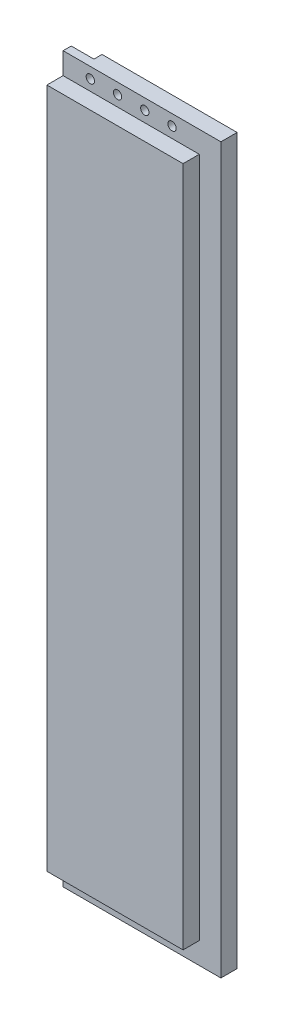
ISO-10303-21;
HEADER;
FILE_DESCRIPTION(('STEP AP214'),'2;1');
FILE_NAME('part.step','',(''),(''),'','','');
FILE_SCHEMA(('AUTOMOTIVE_DESIGN { 1 0 10303 214 1 1 1 1 }'));
ENDSEC;
DATA;
#1=APPLICATION_CONTEXT('core data for automotive mechanical design processes');
#2=APPLICATION_PROTOCOL_DEFINITION('international standard','automotive_design',2000,#1);
#3=PRODUCT_CONTEXT('',#1,'mechanical');
#4=PRODUCT('Part','Part','',(#3));
#5=PRODUCT_RELATED_PRODUCT_CATEGORY('part','',(#4));
#6=PRODUCT_DEFINITION_FORMATION('','',#4);
#7=PRODUCT_DEFINITION_CONTEXT('part definition',#1,'design');
#8=PRODUCT_DEFINITION('design','',#6,#7);
#9=PRODUCT_DEFINITION_SHAPE('','',#8);
#10=(LENGTH_UNIT() NAMED_UNIT(*) SI_UNIT(.MILLI.,.METRE.));
#11=(NAMED_UNIT(*) PLANE_ANGLE_UNIT() SI_UNIT($,.RADIAN.));
#12=(NAMED_UNIT(*) SI_UNIT($,.STERADIAN.) SOLID_ANGLE_UNIT());
#13=UNCERTAINTY_MEASURE_WITH_UNIT(LENGTH_MEASURE(1.E-05),#10,'distance_accuracy_value','');
#14=(GEOMETRIC_REPRESENTATION_CONTEXT(3) GLOBAL_UNCERTAINTY_ASSIGNED_CONTEXT((#13)) GLOBAL_UNIT_ASSIGNED_CONTEXT((#10,
#11,#12)) REPRESENTATION_CONTEXT('',''));
#15=CARTESIAN_POINT('',(0.,0.,0.));
#16=DIRECTION('',(0.,0.,1.));
#17=DIRECTION('',(1.,0.,0.));
#18=AXIS2_PLACEMENT_3D('',#15,#16,#17);
#19=CARTESIAN_POINT('',(-67.9096471096971,425.45,-3.31673558824982));
#20=DIRECTION('',(1.,0.,0.));
#21=DIRECTION('',(0.,0.,-1.));
#22=AXIS2_PLACEMENT_3D('',#19,#20,#21);
#23=PLANE('',#22);
#24=DIRECTION('',(0.,1.,0.));
#25=VECTOR('',#24,1.);
#26=CARTESIAN_POINT('',(-67.9096471096971,0.,1.43306441175018));
#27=LINE('',#26,#25);
#28=CARTESIAN_POINT('',(-67.9096471096971,0.,1.43306441175018));
#29=VERTEX_POINT('',#28);
#30=CARTESIAN_POINT('',(-67.9096471096971,425.45,1.43306441175018));
#31=VERTEX_POINT('',#30);
#32=EDGE_CURVE('E242',#29,#31,#27,.T.);
#33=ORIENTED_EDGE('',*,*,#32,.F.);
#34=DIRECTION('',(0.,0.,1.));
#35=VECTOR('',#34,1.);
#36=CARTESIAN_POINT('',(-67.9096471096971,0.,-3.31673558824982));
#37=LINE('',#36,#35);
#38=CARTESIAN_POINT('',(-67.9096471096971,0.,6.20826441175017));
#39=VERTEX_POINT('',#38);
#40=EDGE_CURVE('E138',#29,#39,#37,.T.);
#41=ORIENTED_EDGE('',*,*,#40,.T.);
#42=DIRECTION('',(0.,1.,0.));
#43=VECTOR('',#42,1.);
#44=CARTESIAN_POINT('',(-67.9096471096971,12.7,6.20826441175018));
#45=LINE('',#44,#43);
#46=CARTESIAN_POINT('',(-67.9096471096971,12.7,6.20826441175018));
#47=VERTEX_POINT('',#46);
#48=EDGE_CURVE('E185',#39,#47,#45,.T.);
#49=ORIENTED_EDGE('',*,*,#48,.T.);
#50=DIRECTION('',(0.,0.,1.));
#51=VECTOR('',#50,1.);
#52=CARTESIAN_POINT('',(-67.9096471096971,12.7,15.7332644117502));
#53=LINE('',#52,#51);
#54=CARTESIAN_POINT('',(-67.9096471096971,12.7,15.7332644117502));
#55=VERTEX_POINT('',#54);
#56=EDGE_CURVE('E177',#47,#55,#53,.T.);
#57=ORIENTED_EDGE('',*,*,#56,.T.);
#58=DIRECTION('',(0.,-1.,0.));
#59=VECTOR('',#58,1.);
#60=CARTESIAN_POINT('',(-67.9096471096971,425.45,15.7332644117502));
#61=LINE('',#60,#59);
#62=CARTESIAN_POINT('',(-67.9096471096971,412.75,15.7332644117502));
#63=VERTEX_POINT('',#62);
#64=EDGE_CURVE('E11',#63,#55,#61,.T.);
#65=ORIENTED_EDGE('',*,*,#64,.F.);
#66=DIRECTION('',(0.,0.,-1.));
#67=VECTOR('',#66,1.);
#68=CARTESIAN_POINT('',(-67.9096471096971,412.75,15.7332644117502));
#69=LINE('',#68,#67);
#70=CARTESIAN_POINT('',(-67.9096471096971,412.75,6.20826441175018));
#71=VERTEX_POINT('',#70);
#72=EDGE_CURVE('E167',#63,#71,#69,.T.);
#73=ORIENTED_EDGE('',*,*,#72,.T.);
#74=DIRECTION('',(0.,1.,0.));
#75=VECTOR('',#74,1.);
#76=CARTESIAN_POINT('',(-67.9096471096971,425.45,6.20826441175018));
#77=LINE('',#76,#75);
#78=CARTESIAN_POINT('',(-67.9096471096971,425.45,6.20826441175018));
#79=VERTEX_POINT('',#78);
#80=EDGE_CURVE('E162',#71,#79,#77,.T.);
#81=ORIENTED_EDGE('',*,*,#80,.T.);
#82=DIRECTION('',(0.,0.,1.));
#83=VECTOR('',#82,1.);
#84=CARTESIAN_POINT('',(-67.9096471096971,425.45,-3.31673558824982));
#85=LINE('',#84,#83);
#86=EDGE_CURVE('E133',#31,#79,#85,.T.);
#87=ORIENTED_EDGE('',*,*,#86,.F.);
#88=EDGE_LOOP('',(#33,#41,#49,#57,#65,#73,#81,#87));
#89=FACE_BOUND('',#88,.T.);
#90=ADVANCED_FACE('F33',(#89),#23,.F.);
#91=CARTESIAN_POINT('',(-67.9096471096971,425.45,-3.31673558824982));
#92=DIRECTION('',(0.,0.,1.));
#93=DIRECTION('',(1.,0.,0.));
#94=AXIS2_PLACEMENT_3D('',#91,#92,#93);
#95=PLANE('',#94);
#96=CARTESIAN_POINT('',(-3.91164710969707,419.1,-3.31673558824982));
#97=DIRECTION('',(0.,0.,1.));
#98=DIRECTION('',(1.,0.,0.));
#99=AXIS2_PLACEMENT_3D('',#96,#97,#98);
#100=CIRCLE('',#99,2.45745);
#101=CARTESIAN_POINT('',(-1.45419710969707,419.1,-3.31673558824982));
#102=VERTEX_POINT('',#101);
#103=EDGE_CURVE('E194',#102,#102,#100,.T.);
#104=ORIENTED_EDGE('',*,*,#103,.T.);
#105=EDGE_LOOP('',(#104));
#106=FACE_BOUND('',#105,.T.);
#107=CARTESIAN_POINT('',(-19.9136471096971,419.1,-3.31673558824982));
#108=DIRECTION('',(0.,0.,1.));
#109=DIRECTION('',(1.,0.,0.));
#110=AXIS2_PLACEMENT_3D('',#107,#108,#109);
#111=CIRCLE('',#110,2.45745);
#112=CARTESIAN_POINT('',(-17.4561971096971,419.1,-3.31673558824982));
#113=VERTEX_POINT('',#112);
#114=EDGE_CURVE('E200',#113,#113,#111,.T.);
#115=ORIENTED_EDGE('',*,*,#114,.T.);
#116=EDGE_LOOP('',(#115));
#117=FACE_BOUND('',#116,.T.);
#118=CARTESIAN_POINT('',(-35.9156471096971,419.1,-3.31673558824982));
#119=DIRECTION('',(0.,0.,1.));
#120=DIRECTION('',(1.,0.,0.));
#121=AXIS2_PLACEMENT_3D('',#118,#119,#120);
#122=CIRCLE('',#121,2.45745);
#123=CARTESIAN_POINT('',(-33.4581971096971,419.1,-3.31673558824982));
#124=VERTEX_POINT('',#123);
#125=EDGE_CURVE('E206',#124,#124,#122,.T.);
#126=ORIENTED_EDGE('',*,*,#125,.T.);
#127=EDGE_LOOP('',(#126));
#128=FACE_BOUND('',#127,.T.);
#129=CARTESIAN_POINT('',(-51.9176471096971,419.1,-3.31673558824982));
#130=DIRECTION('',(0.,0.,1.));
#131=DIRECTION('',(1.,0.,0.));
#132=AXIS2_PLACEMENT_3D('',#129,#130,#131);
#133=CIRCLE('',#132,2.45745);
#134=CARTESIAN_POINT('',(-49.4601971096971,419.1,-3.31673558824982));
#135=VERTEX_POINT('',#134);
#136=EDGE_CURVE('E212',#135,#135,#133,.T.);
#137=ORIENTED_EDGE('',*,*,#136,.T.);
#138=EDGE_LOOP('',(#137));
#139=FACE_BOUND('',#138,.T.);
#140=CARTESIAN_POINT('',(-3.91164710969707,6.35000000000002,-3.31673558824982));
#141=DIRECTION('',(0.,0.,1.));
#142=DIRECTION('',(1.,0.,0.));
#143=AXIS2_PLACEMENT_3D('',#140,#141,#142);
#144=CIRCLE('',#143,2.45745);
#145=CARTESIAN_POINT('',(-1.45419710969707,6.35000000000002,-3.31673558824982));
#146=VERTEX_POINT('',#145);
#147=EDGE_CURVE('E218',#146,#146,#144,.T.);
#148=ORIENTED_EDGE('',*,*,#147,.T.);
#149=EDGE_LOOP('',(#148));
#150=FACE_BOUND('',#149,.T.);
#151=CARTESIAN_POINT('',(-19.9136471096971,6.35000000000002,-3.31673558824982));
#152=DIRECTION('',(0.,0.,1.));
#153=DIRECTION('',(1.,0.,0.));
#154=AXIS2_PLACEMENT_3D('',#151,#152,#153);
#155=CIRCLE('',#154,2.45745);
#156=CARTESIAN_POINT('',(-17.4561971096971,6.35000000000002,-3.31673558824982));
#157=VERTEX_POINT('',#156);
#158=EDGE_CURVE('E224',#157,#157,#155,.T.);
#159=ORIENTED_EDGE('',*,*,#158,.T.);
#160=EDGE_LOOP('',(#159));
#161=FACE_BOUND('',#160,.T.);
#162=CARTESIAN_POINT('',(-35.9156471096971,6.35000000000002,-3.31673558824982));
#163=DIRECTION('',(0.,0.,1.));
#164=DIRECTION('',(1.,0.,0.));
#165=AXIS2_PLACEMENT_3D('',#162,#163,#164);
#166=CIRCLE('',#165,2.45745);
#167=CARTESIAN_POINT('',(-33.4581971096971,6.35000000000002,-3.31673558824982));
#168=VERTEX_POINT('',#167);
#169=EDGE_CURVE('E230',#168,#168,#166,.T.);
#170=ORIENTED_EDGE('',*,*,#169,.T.);
#171=EDGE_LOOP('',(#170));
#172=FACE_BOUND('',#171,.T.);
#173=CARTESIAN_POINT('',(-51.9176471096971,6.35,-3.31673558824982));
#174=DIRECTION('',(0.,0.,1.));
#175=DIRECTION('',(1.,0.,0.));
#176=AXIS2_PLACEMENT_3D('',#173,#174,#175);
#177=CIRCLE('',#176,2.45745);
#178=CARTESIAN_POINT('',(-49.4601971096971,6.35,-3.31673558824982));
#179=VERTEX_POINT('',#178);
#180=EDGE_CURVE('E236',#179,#179,#177,.T.);
#181=ORIENTED_EDGE('',*,*,#180,.T.);
#182=EDGE_LOOP('',(#181));
#183=FACE_BOUND('',#182,.T.);
#184=DIRECTION('',(0.,1.,0.));
#185=VECTOR('',#184,1.);
#186=CARTESIAN_POINT('',(-54.5746471096971,0.,-3.31673558824982));
#187=LINE('',#186,#185);
#188=CARTESIAN_POINT('',(-54.5746471096971,0.,-3.31673558824982));
#189=VERTEX_POINT('',#188);
#190=CARTESIAN_POINT('',(-54.5746471096971,425.45,-3.31673558824982));
#191=VERTEX_POINT('',#190);
#192=EDGE_CURVE('E108',#189,#191,#187,.T.);
#193=ORIENTED_EDGE('',*,*,#192,.T.);
#194=DIRECTION('',(-1.,0.,0.));
#195=VECTOR('',#194,1.);
#196=CARTESIAN_POINT('',(-67.9096471096971,425.45,-3.31673558824982));
#197=LINE('',#196,#195);
#198=CARTESIAN_POINT('',(24.7903528903029,425.45,-3.31673558824982));
#199=VERTEX_POINT('',#198);
#200=EDGE_CURVE('E141',#199,#191,#197,.T.);
#201=ORIENTED_EDGE('',*,*,#200,.F.);
#202=DIRECTION('',(0.,-1.,0.));
#203=VECTOR('',#202,1.);
#204=CARTESIAN_POINT('',(24.7903528903029,425.45,-3.31673558824982));
#205=LINE('',#204,#203);
#206=CARTESIAN_POINT('',(24.7903528903029,0.,-3.31673558824982));
#207=VERTEX_POINT('',#206);
#208=EDGE_CURVE('E40',#199,#207,#205,.T.);
#209=ORIENTED_EDGE('',*,*,#208,.T.);
#210=DIRECTION('',(-1.,0.,0.));
#211=VECTOR('',#210,1.);
#212=CARTESIAN_POINT('',(-67.9096471096971,0.,-3.31673558824982));
#213=LINE('',#212,#211);
#214=EDGE_CURVE('E125',#207,#189,#213,.T.);
#215=ORIENTED_EDGE('',*,*,#214,.T.);
#216=EDGE_LOOP('',(#193,#201,#209,#215));
#217=FACE_BOUND('',#216,.T.);
#218=ADVANCED_FACE('F131',(#106,#117,#128,#139,#150,#161,#172,#183,#217),#95,.F.);
#219=CARTESIAN_POINT('',(0.,425.45,0.));
#220=DIRECTION('',(0.,1.,0.));
#221=DIRECTION('',(0.,0.,1.));
#222=AXIS2_PLACEMENT_3D('',#219,#220,#221);
#223=PLANE('',#222);
#224=ORIENTED_EDGE('',*,*,#200,.T.);
#225=DIRECTION('',(0.,0.,1.));
#226=VECTOR('',#225,1.);
#227=CARTESIAN_POINT('',(-54.5746471096971,425.45,-3.31673558824982));
#228=LINE('',#227,#226);
#229=CARTESIAN_POINT('',(-54.5746471096971,425.45,1.43306441175018));
#230=VERTEX_POINT('',#229);
#231=EDGE_CURVE('E114',#191,#230,#228,.T.);
#232=ORIENTED_EDGE('',*,*,#231,.T.);
#233=DIRECTION('',(-1.,0.,0.));
#234=VECTOR('',#233,1.);
#235=CARTESIAN_POINT('',(-67.9096471096971,425.45,1.43306441175018));
#236=LINE('',#235,#234);
#237=EDGE_CURVE('E128',#230,#31,#236,.T.);
#238=ORIENTED_EDGE('',*,*,#237,.T.);
#239=ORIENTED_EDGE('',*,*,#86,.T.);
#240=DIRECTION('',(1.,0.,0.));
#241=VECTOR('',#240,1.);
#242=CARTESIAN_POINT('',(-67.9096471096971,425.45,6.20826441175018));
#243=LINE('',#242,#241);
#244=CARTESIAN_POINT('',(24.7903528903029,425.45,6.20826441175017));
#245=VERTEX_POINT('',#244);
#246=EDGE_CURVE('E145',#79,#245,#243,.T.);
#247=ORIENTED_EDGE('',*,*,#246,.T.);
#248=DIRECTION('',(0.,0.,-1.));
#249=VECTOR('',#248,1.);
#250=CARTESIAN_POINT('',(24.7903528903029,425.45,-3.31673558824982));
#251=LINE('',#250,#249);
#252=EDGE_CURVE('E136',#245,#199,#251,.T.);
#253=ORIENTED_EDGE('',*,*,#252,.T.);
#254=EDGE_LOOP('',(#224,#232,#238,#239,#247,#253));
#255=FACE_BOUND('',#254,.T.);
#256=ADVANCED_FACE('F275',(#255),#223,.T.);
#257=CARTESIAN_POINT('',(0.,0.,0.));
#258=DIRECTION('',(0.,1.,0.));
#259=DIRECTION('',(0.,0.,1.));
#260=AXIS2_PLACEMENT_3D('',#257,#258,#259);
#261=PLANE('',#260);
#262=DIRECTION('',(0.,0.,1.));
#263=VECTOR('',#262,1.);
#264=CARTESIAN_POINT('',(-54.5746471096971,0.,-3.31673558824982));
#265=LINE('',#264,#263);
#266=CARTESIAN_POINT('',(-54.5746471096971,0.,1.43306441175018));
#267=VERTEX_POINT('',#266);
#268=EDGE_CURVE('E111',#189,#267,#265,.T.);
#269=ORIENTED_EDGE('',*,*,#268,.F.);
#270=ORIENTED_EDGE('',*,*,#214,.F.);
#271=DIRECTION('',(0.,0.,-1.));
#272=VECTOR('',#271,1.);
#273=CARTESIAN_POINT('',(24.7903528903029,0.,-3.31673558824982));
#274=LINE('',#273,#272);
#275=CARTESIAN_POINT('',(24.7903528903029,0.,6.20826441175018));
#276=VERTEX_POINT('',#275);
#277=EDGE_CURVE('E134',#276,#207,#274,.T.);
#278=ORIENTED_EDGE('',*,*,#277,.F.);
#279=DIRECTION('',(1.,0.,0.));
#280=VECTOR('',#279,1.);
#281=CARTESIAN_POINT('',(-67.9096471096971,0.,6.20826441175018));
#282=LINE('',#281,#280);
#283=EDGE_CURVE('E173',#39,#276,#282,.T.);
#284=ORIENTED_EDGE('',*,*,#283,.F.);
#285=ORIENTED_EDGE('',*,*,#40,.F.);
#286=DIRECTION('',(-1.,0.,0.));
#287=VECTOR('',#286,1.);
#288=CARTESIAN_POINT('',(-67.9096471096971,0.,1.43306441175018));
#289=LINE('',#288,#287);
#290=EDGE_CURVE('E127',#267,#29,#289,.T.);
#291=ORIENTED_EDGE('',*,*,#290,.F.);
#292=EDGE_LOOP('',(#269,#270,#278,#284,#285,#291));
#293=FACE_BOUND('',#292,.T.);
#294=ADVANCED_FACE('F123',(#293),#261,.F.);
#295=CARTESIAN_POINT('',(-67.9096471096971,425.45,15.7332644117502));
#296=DIRECTION('',(0.,0.,-1.));
#297=DIRECTION('',(-1.,0.,0.));
#298=AXIS2_PLACEMENT_3D('',#295,#296,#297);
#299=PLANE('',#298);
#300=DIRECTION('',(1.,0.,0.));
#301=VECTOR('',#300,1.);
#302=CARTESIAN_POINT('',(-67.9096471096971,12.7,15.7332644117502));
#303=LINE('',#302,#301);
#304=CARTESIAN_POINT('',(12.0903528903029,12.7,15.7332644117502));
#305=VERTEX_POINT('',#304);
#306=EDGE_CURVE('E180',#55,#305,#303,.T.);
#307=ORIENTED_EDGE('',*,*,#306,.T.);
#308=DIRECTION('',(0.,-1.,0.));
#309=VECTOR('',#308,1.);
#310=CARTESIAN_POINT('',(12.0903528903029,425.45,15.7332644117502));
#311=LINE('',#310,#309);
#312=CARTESIAN_POINT('',(12.0903528903029,412.75,15.7332644117502));
#313=VERTEX_POINT('',#312);
#314=EDGE_CURVE('E189',#313,#305,#311,.T.);
#315=ORIENTED_EDGE('',*,*,#314,.F.);
#316=DIRECTION('',(1.,0.,0.));
#317=VECTOR('',#316,1.);
#318=CARTESIAN_POINT('',(-67.9096471096971,412.75,15.7332644117502));
#319=LINE('',#318,#317);
#320=EDGE_CURVE('E155',#63,#313,#319,.T.);
#321=ORIENTED_EDGE('',*,*,#320,.F.);
#322=ORIENTED_EDGE('',*,*,#64,.T.);
#323=EDGE_LOOP('',(#307,#315,#321,#322));
#324=FACE_BOUND('',#323,.T.);
#325=ADVANCED_FACE('F256',(#324),#299,.F.);
#326=CARTESIAN_POINT('',(24.7903528903029,425.45,-3.31673558824982));
#327=DIRECTION('',(-1.,0.,0.));
#328=DIRECTION('',(0.,0.,1.));
#329=AXIS2_PLACEMENT_3D('',#326,#327,#328);
#330=PLANE('',#329);
#331=DIRECTION('',(0.,1.,0.));
#332=VECTOR('',#331,1.);
#333=CARTESIAN_POINT('',(24.7903528903029,425.45,6.20826441175018));
#334=LINE('',#333,#332);
#335=EDGE_CURVE('E158',#276,#245,#334,.T.);
#336=ORIENTED_EDGE('',*,*,#335,.F.);
#337=ORIENTED_EDGE('',*,*,#277,.T.);
#338=ORIENTED_EDGE('',*,*,#208,.F.);
#339=ORIENTED_EDGE('',*,*,#252,.F.);
#340=EDGE_LOOP('',(#336,#337,#338,#339));
#341=FACE_BOUND('',#340,.T.);
#342=ADVANCED_FACE('F285',(#341),#330,.F.);
#343=CARTESIAN_POINT('',(-67.9096471096971,425.45,6.20826441175018));
#344=DIRECTION('',(0.,0.,-1.));
#345=DIRECTION('',(0.,1.,0.));
#346=AXIS2_PLACEMENT_3D('',#343,#344,#345);
#347=PLANE('',#346);
#348=CARTESIAN_POINT('',(-51.9176471096971,6.35,6.20826441175009));
#349=DIRECTION('',(0.,0.,1.));
#350=DIRECTION('',(1.,0.,0.));
#351=AXIS2_PLACEMENT_3D('',#348,#349,#350);
#352=CIRCLE('',#351,2.45744999999999);
#353=CARTESIAN_POINT('',(-49.4601971096971,6.35,6.20826441175009));
#354=VERTEX_POINT('',#353);
#355=EDGE_CURVE('E119',#354,#354,#352,.T.);
#356=ORIENTED_EDGE('',*,*,#355,.F.);
#357=EDGE_LOOP('',(#356));
#358=FACE_BOUND('',#357,.T.);
#359=CARTESIAN_POINT('',(-35.9156471096971,6.35000000000002,6.20826441175009));
#360=DIRECTION('',(0.,0.,1.));
#361=DIRECTION('',(1.,0.,0.));
#362=AXIS2_PLACEMENT_3D('',#359,#360,#361);
#363=CIRCLE('',#362,2.45744999999999);
#364=CARTESIAN_POINT('',(-33.4581971096971,6.35000000000002,6.20826441175009));
#365=VERTEX_POINT('',#364);
#366=EDGE_CURVE('E233',#365,#365,#363,.T.);
#367=ORIENTED_EDGE('',*,*,#366,.F.);
#368=EDGE_LOOP('',(#367));
#369=FACE_BOUND('',#368,.T.);
#370=CARTESIAN_POINT('',(-19.9136471096971,6.35000000000002,6.20826441175009));
#371=DIRECTION('',(0.,0.,1.));
#372=DIRECTION('',(1.,0.,0.));
#373=AXIS2_PLACEMENT_3D('',#370,#371,#372);
#374=CIRCLE('',#373,2.45744999999999);
#375=CARTESIAN_POINT('',(-17.4561971096971,6.35000000000002,6.20826441175009));
#376=VERTEX_POINT('',#375);
#377=EDGE_CURVE('E227',#376,#376,#374,.T.);
#378=ORIENTED_EDGE('',*,*,#377,.F.);
#379=EDGE_LOOP('',(#378));
#380=FACE_BOUND('',#379,.T.);
#381=CARTESIAN_POINT('',(-3.91164710969707,6.35000000000002,6.20826441175009));
#382=DIRECTION('',(0.,0.,1.));
#383=DIRECTION('',(1.,0.,0.));
#384=AXIS2_PLACEMENT_3D('',#381,#382,#383);
#385=CIRCLE('',#384,2.45744999999999);
#386=CARTESIAN_POINT('',(-1.45419710969708,6.35000000000002,6.20826441175009));
#387=VERTEX_POINT('',#386);
#388=EDGE_CURVE('E221',#387,#387,#385,.T.);
#389=ORIENTED_EDGE('',*,*,#388,.F.);
#390=EDGE_LOOP('',(#389));
#391=FACE_BOUND('',#390,.T.);
#392=CARTESIAN_POINT('',(-51.9176471096971,419.1,6.20826441175009));
#393=DIRECTION('',(0.,0.,1.));
#394=DIRECTION('',(1.,0.,0.));
#395=AXIS2_PLACEMENT_3D('',#392,#393,#394);
#396=CIRCLE('',#395,2.45744999999999);
#397=CARTESIAN_POINT('',(-49.4601971096971,419.1,6.20826441175009));
#398=VERTEX_POINT('',#397);
#399=EDGE_CURVE('E215',#398,#398,#396,.T.);
#400=ORIENTED_EDGE('',*,*,#399,.F.);
#401=EDGE_LOOP('',(#400));
#402=FACE_BOUND('',#401,.T.);
#403=CARTESIAN_POINT('',(-35.9156471096971,419.1,6.20826441175009));
#404=DIRECTION('',(0.,0.,1.));
#405=DIRECTION('',(1.,0.,0.));
#406=AXIS2_PLACEMENT_3D('',#403,#404,#405);
#407=CIRCLE('',#406,2.45744999999999);
#408=CARTESIAN_POINT('',(-33.4581971096971,419.1,6.20826441175009));
#409=VERTEX_POINT('',#408);
#410=EDGE_CURVE('E209',#409,#409,#407,.T.);
#411=ORIENTED_EDGE('',*,*,#410,.F.);
#412=EDGE_LOOP('',(#411));
#413=FACE_BOUND('',#412,.T.);
#414=CARTESIAN_POINT('',(-19.9136471096971,419.1,6.20826441175009));
#415=DIRECTION('',(0.,0.,1.));
#416=DIRECTION('',(1.,0.,0.));
#417=AXIS2_PLACEMENT_3D('',#414,#415,#416);
#418=CIRCLE('',#417,2.45744999999999);
#419=CARTESIAN_POINT('',(-17.4561971096971,419.1,6.20826441175009));
#420=VERTEX_POINT('',#419);
#421=EDGE_CURVE('E203',#420,#420,#418,.T.);
#422=ORIENTED_EDGE('',*,*,#421,.F.);
#423=EDGE_LOOP('',(#422));
#424=FACE_BOUND('',#423,.T.);
#425=CARTESIAN_POINT('',(-3.91164710969707,419.1,6.20826441175009));
#426=DIRECTION('',(0.,0.,1.));
#427=DIRECTION('',(1.,0.,0.));
#428=AXIS2_PLACEMENT_3D('',#425,#426,#427);
#429=CIRCLE('',#428,2.45744999999999);
#430=CARTESIAN_POINT('',(-1.45419710969708,419.1,6.20826441175009));
#431=VERTEX_POINT('',#430);
#432=EDGE_CURVE('E197',#431,#431,#429,.T.);
#433=ORIENTED_EDGE('',*,*,#432,.F.);
#434=EDGE_LOOP('',(#433));
#435=FACE_BOUND('',#434,.T.);
#436=DIRECTION('',(1.,0.,0.));
#437=VECTOR('',#436,1.);
#438=CARTESIAN_POINT('',(-67.9096471096971,412.75,6.20826441175018));
#439=LINE('',#438,#437);
#440=CARTESIAN_POINT('',(12.0903528903029,412.75,6.20826441175018));
#441=VERTEX_POINT('',#440);
#442=EDGE_CURVE('E150',#71,#441,#439,.T.);
#443=ORIENTED_EDGE('',*,*,#442,.T.);
#444=DIRECTION('',(0.,-1.,0.));
#445=VECTOR('',#444,1.);
#446=CARTESIAN_POINT('',(12.0903528903029,425.45,6.20826441175018));
#447=LINE('',#446,#445);
#448=CARTESIAN_POINT('',(12.0903528903029,12.7,6.20826441175018));
#449=VERTEX_POINT('',#448);
#450=EDGE_CURVE('E190',#441,#449,#447,.T.);
#451=ORIENTED_EDGE('',*,*,#450,.T.);
#452=DIRECTION('',(1.,0.,0.));
#453=VECTOR('',#452,1.);
#454=CARTESIAN_POINT('',(-67.9096471096971,12.7,6.20826441175018));
#455=LINE('',#454,#453);
#456=EDGE_CURVE('E176',#47,#449,#455,.T.);
#457=ORIENTED_EDGE('',*,*,#456,.F.);
#458=ORIENTED_EDGE('',*,*,#48,.F.);
#459=ORIENTED_EDGE('',*,*,#283,.T.);
#460=ORIENTED_EDGE('',*,*,#335,.T.);
#461=ORIENTED_EDGE('',*,*,#246,.F.);
#462=ORIENTED_EDGE('',*,*,#80,.F.);
#463=EDGE_LOOP('',(#443,#451,#457,#458,#459,#460,#461,#462));
#464=FACE_BOUND('',#463,.T.);
#465=ADVANCED_FACE('F250',(#358,#369,#380,#391,#402,#413,#424,#435,#464),#347,.F.);
#466=CARTESIAN_POINT('',(-67.9096471096971,412.75,15.7332644117502));
#467=DIRECTION('',(0.,-1.,0.));
#468=DIRECTION('',(0.,0.,-1.));
#469=AXIS2_PLACEMENT_3D('',#466,#467,#468);
#470=PLANE('',#469);
#471=ORIENTED_EDGE('',*,*,#320,.T.);
#472=DIRECTION('',(0.,0.,-1.));
#473=VECTOR('',#472,1.);
#474=CARTESIAN_POINT('',(12.0903528903029,412.75,15.7332644117502));
#475=LINE('',#474,#473);
#476=EDGE_CURVE('E187',#313,#441,#475,.T.);
#477=ORIENTED_EDGE('',*,*,#476,.T.);
#478=ORIENTED_EDGE('',*,*,#442,.F.);
#479=ORIENTED_EDGE('',*,*,#72,.F.);
#480=EDGE_LOOP('',(#471,#477,#478,#479));
#481=FACE_BOUND('',#480,.T.);
#482=ADVANCED_FACE('F261',(#481),#470,.F.);
#483=CARTESIAN_POINT('',(-67.9096471096971,12.7,15.7332644117502));
#484=DIRECTION('',(0.,1.,0.));
#485=DIRECTION('',(0.,0.,1.));
#486=AXIS2_PLACEMENT_3D('',#483,#484,#485);
#487=PLANE('',#486);
#488=ORIENTED_EDGE('',*,*,#456,.T.);
#489=DIRECTION('',(0.,0.,-1.));
#490=VECTOR('',#489,1.);
#491=CARTESIAN_POINT('',(12.0903528903029,12.7,15.7332644117502));
#492=LINE('',#491,#490);
#493=EDGE_CURVE('E55',#305,#449,#492,.T.);
#494=ORIENTED_EDGE('',*,*,#493,.F.);
#495=ORIENTED_EDGE('',*,*,#306,.F.);
#496=ORIENTED_EDGE('',*,*,#56,.F.);
#497=EDGE_LOOP('',(#488,#494,#495,#496));
#498=FACE_BOUND('',#497,.T.);
#499=ADVANCED_FACE('F259',(#498),#487,.F.);
#500=CARTESIAN_POINT('',(12.0903528903029,425.45,15.7332644117502));
#501=DIRECTION('',(-1.,0.,0.));
#502=DIRECTION('',(0.,0.,1.));
#503=AXIS2_PLACEMENT_3D('',#500,#501,#502);
#504=PLANE('',#503);
#505=ORIENTED_EDGE('',*,*,#314,.T.);
#506=ORIENTED_EDGE('',*,*,#493,.T.);
#507=ORIENTED_EDGE('',*,*,#450,.F.);
#508=ORIENTED_EDGE('',*,*,#476,.F.);
#509=EDGE_LOOP('',(#505,#506,#507,#508));
#510=FACE_BOUND('',#509,.T.);
#511=ADVANCED_FACE('F258',(#510),#504,.F.);
#512=CARTESIAN_POINT('',(-3.91164710969707,419.1,6.20826441175009));
#513=DIRECTION('',(0.,0.,1.));
#514=DIRECTION('',(1.,0.,0.));
#515=AXIS2_PLACEMENT_3D('',#512,#513,#514);
#516=CYLINDRICAL_SURFACE('',#515,2.45744999999999);
#517=ORIENTED_EDGE('',*,*,#103,.F.);
#518=EDGE_LOOP('',(#517));
#519=FACE_BOUND('',#518,.T.);
#520=ORIENTED_EDGE('',*,*,#432,.T.);
#521=EDGE_LOOP('',(#520));
#522=FACE_BOUND('',#521,.T.);
#523=ADVANCED_FACE('F267',(#519,#522),#516,.F.);
#524=CARTESIAN_POINT('',(-19.9136471096971,419.1,6.20826441175009));
#525=DIRECTION('',(0.,0.,1.));
#526=DIRECTION('',(1.,0.,0.));
#527=AXIS2_PLACEMENT_3D('',#524,#525,#526);
#528=CYLINDRICAL_SURFACE('',#527,2.45744999999999);
#529=ORIENTED_EDGE('',*,*,#114,.F.);
#530=EDGE_LOOP('',(#529));
#531=FACE_BOUND('',#530,.T.);
#532=ORIENTED_EDGE('',*,*,#421,.T.);
#533=EDGE_LOOP('',(#532));
#534=FACE_BOUND('',#533,.T.);
#535=ADVANCED_FACE('F369',(#531,#534),#528,.F.);
#536=CARTESIAN_POINT('',(-35.9156471096971,419.1,6.20826441175009));
#537=DIRECTION('',(0.,0.,1.));
#538=DIRECTION('',(1.,0.,0.));
#539=AXIS2_PLACEMENT_3D('',#536,#537,#538);
#540=CYLINDRICAL_SURFACE('',#539,2.45744999999999);
#541=ORIENTED_EDGE('',*,*,#125,.F.);
#542=EDGE_LOOP('',(#541));
#543=FACE_BOUND('',#542,.T.);
#544=ORIENTED_EDGE('',*,*,#410,.T.);
#545=EDGE_LOOP('',(#544));
#546=FACE_BOUND('',#545,.T.);
#547=ADVANCED_FACE('F359',(#543,#546),#540,.F.);
#548=CARTESIAN_POINT('',(-51.9176471096971,419.1,6.20826441175009));
#549=DIRECTION('',(0.,0.,1.));
#550=DIRECTION('',(1.,0.,0.));
#551=AXIS2_PLACEMENT_3D('',#548,#549,#550);
#552=CYLINDRICAL_SURFACE('',#551,2.45744999999999);
#553=ORIENTED_EDGE('',*,*,#136,.F.);
#554=EDGE_LOOP('',(#553));
#555=FACE_BOUND('',#554,.T.);
#556=ORIENTED_EDGE('',*,*,#399,.T.);
#557=EDGE_LOOP('',(#556));
#558=FACE_BOUND('',#557,.T.);
#559=ADVANCED_FACE('F349',(#555,#558),#552,.F.);
#560=CARTESIAN_POINT('',(-3.91164710969707,6.35000000000002,6.20826441175009));
#561=DIRECTION('',(0.,0.,1.));
#562=DIRECTION('',(1.,0.,0.));
#563=AXIS2_PLACEMENT_3D('',#560,#561,#562);
#564=CYLINDRICAL_SURFACE('',#563,2.45744999999999);
#565=ORIENTED_EDGE('',*,*,#147,.F.);
#566=EDGE_LOOP('',(#565));
#567=FACE_BOUND('',#566,.T.);
#568=ORIENTED_EDGE('',*,*,#388,.T.);
#569=EDGE_LOOP('',(#568));
#570=FACE_BOUND('',#569,.T.);
#571=ADVANCED_FACE('F339',(#567,#570),#564,.F.);
#572=CARTESIAN_POINT('',(-19.9136471096971,6.35000000000002,6.20826441175009));
#573=DIRECTION('',(0.,0.,1.));
#574=DIRECTION('',(1.,0.,0.));
#575=AXIS2_PLACEMENT_3D('',#572,#573,#574);
#576=CYLINDRICAL_SURFACE('',#575,2.45744999999999);
#577=ORIENTED_EDGE('',*,*,#158,.F.);
#578=EDGE_LOOP('',(#577));
#579=FACE_BOUND('',#578,.T.);
#580=ORIENTED_EDGE('',*,*,#377,.T.);
#581=EDGE_LOOP('',(#580));
#582=FACE_BOUND('',#581,.T.);
#583=ADVANCED_FACE('F329',(#579,#582),#576,.F.);
#584=CARTESIAN_POINT('',(-35.9156471096971,6.35000000000002,6.20826441175009));
#585=DIRECTION('',(0.,0.,1.));
#586=DIRECTION('',(1.,0.,0.));
#587=AXIS2_PLACEMENT_3D('',#584,#585,#586);
#588=CYLINDRICAL_SURFACE('',#587,2.45744999999999);
#589=ORIENTED_EDGE('',*,*,#169,.F.);
#590=EDGE_LOOP('',(#589));
#591=FACE_BOUND('',#590,.T.);
#592=ORIENTED_EDGE('',*,*,#366,.T.);
#593=EDGE_LOOP('',(#592));
#594=FACE_BOUND('',#593,.T.);
#595=ADVANCED_FACE('F318',(#591,#594),#588,.F.);
#596=CARTESIAN_POINT('',(-51.9176471096971,6.35,6.20826441175009));
#597=DIRECTION('',(0.,0.,1.));
#598=DIRECTION('',(1.,0.,0.));
#599=AXIS2_PLACEMENT_3D('',#596,#597,#598);
#600=CYLINDRICAL_SURFACE('',#599,2.45744999999999);
#601=ORIENTED_EDGE('',*,*,#180,.F.);
#602=EDGE_LOOP('',(#601));
#603=FACE_BOUND('',#602,.T.);
#604=ORIENTED_EDGE('',*,*,#355,.T.);
#605=EDGE_LOOP('',(#604));
#606=FACE_BOUND('',#605,.T.);
#607=ADVANCED_FACE('F313',(#603,#606),#600,.F.);
#608=CARTESIAN_POINT('',(-54.5746471096971,0.,-3.31673558824982));
#609=DIRECTION('',(-1.,0.,0.));
#610=DIRECTION('',(0.,0.,1.));
#611=AXIS2_PLACEMENT_3D('',#608,#609,#610);
#612=PLANE('',#611);
#613=ORIENTED_EDGE('',*,*,#231,.F.);
#614=ORIENTED_EDGE('',*,*,#192,.F.);
#615=ORIENTED_EDGE('',*,*,#268,.T.);
#616=DIRECTION('',(0.,1.,0.));
#617=VECTOR('',#616,1.);
#618=CARTESIAN_POINT('',(-54.5746471096971,0.,1.43306441175018));
#619=LINE('',#618,#617);
#620=EDGE_CURVE('E47',#267,#230,#619,.T.);
#621=ORIENTED_EDGE('',*,*,#620,.T.);
#622=EDGE_LOOP('',(#613,#614,#615,#621));
#623=FACE_BOUND('',#622,.T.);
#624=ADVANCED_FACE('F110',(#623),#612,.T.);
#625=CARTESIAN_POINT('',(-67.9096471096971,0.,1.43306441175018));
#626=DIRECTION('',(0.,0.,-1.));
#627=DIRECTION('',(-1.,0.,0.));
#628=AXIS2_PLACEMENT_3D('',#625,#626,#627);
#629=PLANE('',#628);
#630=ORIENTED_EDGE('',*,*,#237,.F.);
#631=ORIENTED_EDGE('',*,*,#620,.F.);
#632=ORIENTED_EDGE('',*,*,#290,.T.);
#633=ORIENTED_EDGE('',*,*,#32,.T.);
#634=EDGE_LOOP('',(#630,#631,#632,#633));
#635=FACE_BOUND('',#634,.T.);
#636=ADVANCED_FACE('F247',(#635),#629,.T.);
#637=CLOSED_SHELL('',(#90,#218,#256,#294,#325,#342,#465,#482,#499,#511,#523,#535,#547,#559,#571,
#583,#595,#607,#624,#636));
#638=MANIFOLD_SOLID_BREP('B2',#637);
#639=ADVANCED_BREP_SHAPE_REPRESENTATION('',(#18,#638),#14);
#640=SHAPE_DEFINITION_REPRESENTATION(#9,#639);
ENDSEC;
END-ISO-10303-21;
